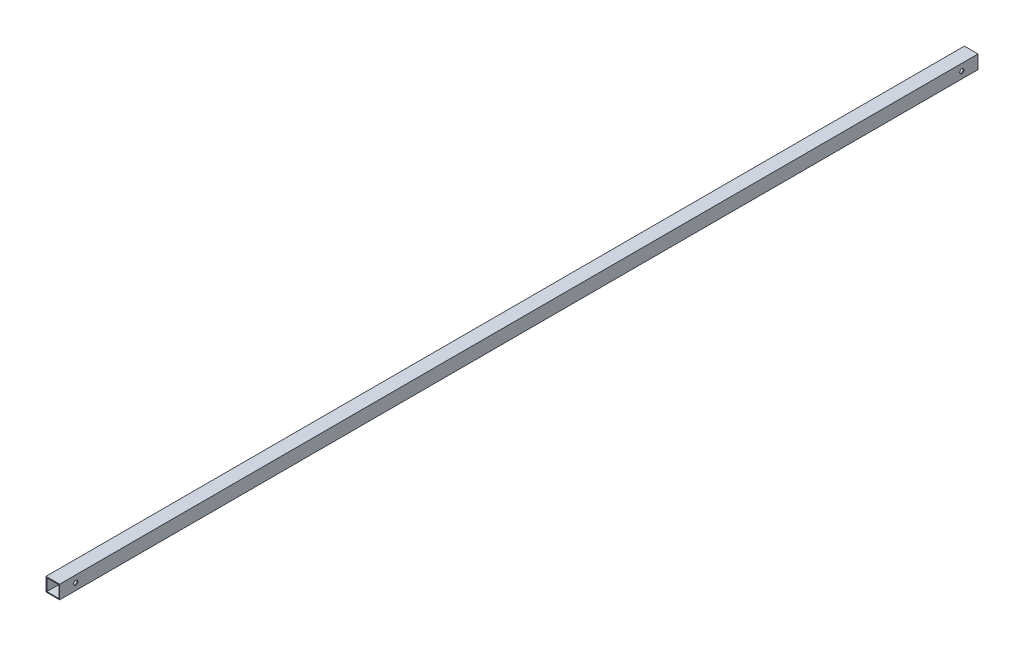
ISO-10303-21;
HEADER;
FILE_DESCRIPTION(('STEP AP214'),'2;1');
FILE_NAME('part.step','',(''),(''),'','','');
FILE_SCHEMA(('AUTOMOTIVE_DESIGN { 1 0 10303 214 1 1 1 1 }'));
ENDSEC;
DATA;
#1=APPLICATION_CONTEXT('core data for automotive mechanical design processes');
#2=APPLICATION_PROTOCOL_DEFINITION('international standard','automotive_design',2000,#1);
#3=PRODUCT_CONTEXT('',#1,'mechanical');
#4=PRODUCT('Part','Part','',(#3));
#5=PRODUCT_RELATED_PRODUCT_CATEGORY('part','',(#4));
#6=PRODUCT_DEFINITION_FORMATION('','',#4);
#7=PRODUCT_DEFINITION_CONTEXT('part definition',#1,'design');
#8=PRODUCT_DEFINITION('design','',#6,#7);
#9=PRODUCT_DEFINITION_SHAPE('','',#8);
#10=(LENGTH_UNIT() NAMED_UNIT(*) SI_UNIT(.MILLI.,.METRE.));
#11=(NAMED_UNIT(*) PLANE_ANGLE_UNIT() SI_UNIT($,.RADIAN.));
#12=(NAMED_UNIT(*) SI_UNIT($,.STERADIAN.) SOLID_ANGLE_UNIT());
#13=UNCERTAINTY_MEASURE_WITH_UNIT(LENGTH_MEASURE(1.E-05),#10,'distance_accuracy_value','');
#14=(GEOMETRIC_REPRESENTATION_CONTEXT(3) GLOBAL_UNCERTAINTY_ASSIGNED_CONTEXT((#13)) GLOBAL_UNIT_ASSIGNED_CONTEXT((#10,
#11,#12)) REPRESENTATION_CONTEXT('',''));
#15=CARTESIAN_POINT('',(0.,0.,0.));
#16=DIRECTION('',(0.,0.,1.));
#17=DIRECTION('',(1.,0.,0.));
#18=AXIS2_PLACEMENT_3D('',#15,#16,#17);
#19=CARTESIAN_POINT('',(-8.,-8.,540.));
#20=DIRECTION('',(0.,0.,1.));
#21=DIRECTION('',(1.,0.,0.));
#22=AXIS2_PLACEMENT_3D('',#19,#20,#21);
#23=PLANE('',#22);
#24=DIRECTION('',(0.,-1.,0.));
#25=VECTOR('',#24,1.);
#26=CARTESIAN_POINT('',(-8.,-8.,540.));
#27=LINE('',#26,#25);
#28=CARTESIAN_POINT('',(-8.,8.,540.));
#29=VERTEX_POINT('',#28);
#30=CARTESIAN_POINT('',(-8.,-8.,540.));
#31=VERTEX_POINT('',#30);
#32=EDGE_CURVE('E161',#29,#31,#27,.T.);
#33=ORIENTED_EDGE('',*,*,#32,.T.);
#34=DIRECTION('',(1.,0.,0.));
#35=VECTOR('',#34,1.);
#36=CARTESIAN_POINT('',(8.,-8.,540.));
#37=LINE('',#36,#35);
#38=CARTESIAN_POINT('',(8.,-8.,540.));
#39=VERTEX_POINT('',#38);
#40=EDGE_CURVE('E164',#31,#39,#37,.T.);
#41=ORIENTED_EDGE('',*,*,#40,.T.);
#42=DIRECTION('',(0.,1.,0.));
#43=VECTOR('',#42,1.);
#44=CARTESIAN_POINT('',(8.,-8.,540.));
#45=LINE('',#44,#43);
#46=CARTESIAN_POINT('',(8.,8.,540.));
#47=VERTEX_POINT('',#46);
#48=EDGE_CURVE('E167',#39,#47,#45,.T.);
#49=ORIENTED_EDGE('',*,*,#48,.T.);
#50=DIRECTION('',(-1.,0.,0.));
#51=VECTOR('',#50,1.);
#52=CARTESIAN_POINT('',(8.,8.,540.));
#53=LINE('',#52,#51);
#54=EDGE_CURVE('E169',#47,#29,#53,.T.);
#55=ORIENTED_EDGE('',*,*,#54,.T.);
#56=EDGE_LOOP('',(#33,#41,#49,#55));
#57=FACE_BOUND('',#56,.T.);
#58=DIRECTION('',(1.,0.,0.));
#59=VECTOR('',#58,1.);
#60=CARTESIAN_POINT('',(8.,-7.,540.));
#61=LINE('',#60,#59);
#62=CARTESIAN_POINT('',(-7.,-7.,540.));
#63=VERTEX_POINT('',#62);
#64=CARTESIAN_POINT('',(7.,-7.,540.));
#65=VERTEX_POINT('',#64);
#66=EDGE_CURVE('E131',#63,#65,#61,.T.);
#67=ORIENTED_EDGE('',*,*,#66,.F.);
#68=DIRECTION('',(0.,-1.,0.));
#69=VECTOR('',#68,1.);
#70=CARTESIAN_POINT('',(-7.,-8.,540.));
#71=LINE('',#70,#69);
#72=CARTESIAN_POINT('',(-7.,7.,540.));
#73=VERTEX_POINT('',#72);
#74=EDGE_CURVE('E123',#73,#63,#71,.T.);
#75=ORIENTED_EDGE('',*,*,#74,.F.);
#76=DIRECTION('',(-1.,0.,0.));
#77=VECTOR('',#76,1.);
#78=CARTESIAN_POINT('',(8.,7.,540.));
#79=LINE('',#78,#77);
#80=CARTESIAN_POINT('',(7.,7.,540.));
#81=VERTEX_POINT('',#80);
#82=EDGE_CURVE('E145',#81,#73,#79,.T.);
#83=ORIENTED_EDGE('',*,*,#82,.F.);
#84=DIRECTION('',(0.,1.,0.));
#85=VECTOR('',#84,1.);
#86=CARTESIAN_POINT('',(7.,-8.,540.));
#87=LINE('',#86,#85);
#88=EDGE_CURVE('E143',#65,#81,#87,.T.);
#89=ORIENTED_EDGE('',*,*,#88,.F.);
#90=EDGE_LOOP('',(#67,#75,#83,#89));
#91=FACE_BOUND('',#90,.T.);
#92=ADVANCED_FACE('F56',(#57,#91),#23,.T.);
#93=CARTESIAN_POINT('',(-8.,-8.,-540.));
#94=DIRECTION('',(0.,0.,1.));
#95=DIRECTION('',(1.,0.,0.));
#96=AXIS2_PLACEMENT_3D('',#93,#94,#95);
#97=PLANE('',#96);
#98=DIRECTION('',(0.,-1.,0.));
#99=VECTOR('',#98,1.);
#100=CARTESIAN_POINT('',(-8.,-8.,-540.));
#101=LINE('',#100,#99);
#102=CARTESIAN_POINT('',(-8.,8.,-540.));
#103=VERTEX_POINT('',#102);
#104=CARTESIAN_POINT('',(-8.,-8.,-540.));
#105=VERTEX_POINT('',#104);
#106=EDGE_CURVE('E139',#103,#105,#101,.T.);
#107=ORIENTED_EDGE('',*,*,#106,.F.);
#108=DIRECTION('',(-1.,0.,0.));
#109=VECTOR('',#108,1.);
#110=CARTESIAN_POINT('',(8.,8.,-540.));
#111=LINE('',#110,#109);
#112=CARTESIAN_POINT('',(8.,8.,-540.));
#113=VERTEX_POINT('',#112);
#114=EDGE_CURVE('E165',#113,#103,#111,.T.);
#115=ORIENTED_EDGE('',*,*,#114,.F.);
#116=DIRECTION('',(0.,1.,0.));
#117=VECTOR('',#116,1.);
#118=CARTESIAN_POINT('',(8.,-8.,-540.));
#119=LINE('',#118,#117);
#120=CARTESIAN_POINT('',(8.,-8.,-540.));
#121=VERTEX_POINT('',#120);
#122=EDGE_CURVE('E176',#121,#113,#119,.T.);
#123=ORIENTED_EDGE('',*,*,#122,.F.);
#124=DIRECTION('',(1.,0.,0.));
#125=VECTOR('',#124,1.);
#126=CARTESIAN_POINT('',(8.,-8.,-540.));
#127=LINE('',#126,#125);
#128=EDGE_CURVE('E174',#105,#121,#127,.T.);
#129=ORIENTED_EDGE('',*,*,#128,.F.);
#130=EDGE_LOOP('',(#107,#115,#123,#129));
#131=FACE_BOUND('',#130,.T.);
#132=DIRECTION('',(0.,-1.,0.));
#133=VECTOR('',#132,1.);
#134=CARTESIAN_POINT('',(-7.,-8.,-540.));
#135=LINE('',#134,#133);
#136=CARTESIAN_POINT('',(-7.,7.,-540.));
#137=VERTEX_POINT('',#136);
#138=CARTESIAN_POINT('',(-7.,-7.,-540.));
#139=VERTEX_POINT('',#138);
#140=EDGE_CURVE('E81',#137,#139,#135,.T.);
#141=ORIENTED_EDGE('',*,*,#140,.T.);
#142=DIRECTION('',(1.,0.,0.));
#143=VECTOR('',#142,1.);
#144=CARTESIAN_POINT('',(8.,-7.,-540.));
#145=LINE('',#144,#143);
#146=CARTESIAN_POINT('',(7.,-7.,-540.));
#147=VERTEX_POINT('',#146);
#148=EDGE_CURVE('E138',#139,#147,#145,.T.);
#149=ORIENTED_EDGE('',*,*,#148,.T.);
#150=DIRECTION('',(0.,1.,0.));
#151=VECTOR('',#150,1.);
#152=CARTESIAN_POINT('',(7.,-8.,-540.));
#153=LINE('',#152,#151);
#154=CARTESIAN_POINT('',(7.,7.,-540.));
#155=VERTEX_POINT('',#154);
#156=EDGE_CURVE('E153',#147,#155,#153,.T.);
#157=ORIENTED_EDGE('',*,*,#156,.T.);
#158=DIRECTION('',(-1.,0.,0.));
#159=VECTOR('',#158,1.);
#160=CARTESIAN_POINT('',(8.,7.,-540.));
#161=LINE('',#160,#159);
#162=EDGE_CURVE('E132',#155,#137,#161,.T.);
#163=ORIENTED_EDGE('',*,*,#162,.T.);
#164=EDGE_LOOP('',(#141,#149,#157,#163));
#165=FACE_BOUND('',#164,.T.);
#166=ADVANCED_FACE('F223',(#131,#165),#97,.F.);
#167=CARTESIAN_POINT('',(-8.,-8.,540.));
#168=DIRECTION('',(1.,0.,0.));
#169=DIRECTION('',(0.,0.,-1.));
#170=AXIS2_PLACEMENT_3D('',#167,#168,#169);
#171=PLANE('',#170);
#172=CARTESIAN_POINT('',(-8.,0.,-521.));
#173=DIRECTION('',(1.,0.,0.));
#174=DIRECTION('',(0.,0.,1.));
#175=AXIS2_PLACEMENT_3D('',#172,#173,#174);
#176=CIRCLE('',#175,2.50000000000003);
#177=CARTESIAN_POINT('',(-8.,0.,-518.5));
#178=VERTEX_POINT('',#177);
#179=EDGE_CURVE('E205',#178,#178,#176,.T.);
#180=ORIENTED_EDGE('',*,*,#179,.T.);
#181=EDGE_LOOP('',(#180));
#182=FACE_BOUND('',#181,.T.);
#183=CARTESIAN_POINT('',(-8.,0.,521.));
#184=DIRECTION('',(1.,0.,0.));
#185=DIRECTION('',(0.,0.,-1.));
#186=AXIS2_PLACEMENT_3D('',#183,#184,#185);
#187=CIRCLE('',#186,2.50000000000003);
#188=CARTESIAN_POINT('',(-8.,0.,518.5));
#189=VERTEX_POINT('',#188);
#190=EDGE_CURVE('E187',#189,#189,#187,.T.);
#191=ORIENTED_EDGE('',*,*,#190,.T.);
#192=EDGE_LOOP('',(#191));
#193=FACE_BOUND('',#192,.T.);
#194=ORIENTED_EDGE('',*,*,#106,.T.);
#195=DIRECTION('',(0.,0.,-1.));
#196=VECTOR('',#195,1.);
#197=CARTESIAN_POINT('',(-8.,-8.,540.));
#198=LINE('',#197,#196);
#199=EDGE_CURVE('E12',#31,#105,#198,.T.);
#200=ORIENTED_EDGE('',*,*,#199,.F.);
#201=ORIENTED_EDGE('',*,*,#32,.F.);
#202=DIRECTION('',(0.,0.,-1.));
#203=VECTOR('',#202,1.);
#204=CARTESIAN_POINT('',(-8.,8.,540.));
#205=LINE('',#204,#203);
#206=EDGE_CURVE('E171',#29,#103,#205,.T.);
#207=ORIENTED_EDGE('',*,*,#206,.T.);
#208=EDGE_LOOP('',(#194,#200,#201,#207));
#209=FACE_BOUND('',#208,.T.);
#210=ADVANCED_FACE('F58',(#182,#193,#209),#171,.F.);
#211=CARTESIAN_POINT('',(8.,-8.,540.));
#212=DIRECTION('',(0.,1.,0.));
#213=DIRECTION('',(-1.,0.,0.));
#214=AXIS2_PLACEMENT_3D('',#211,#212,#213);
#215=PLANE('',#214);
#216=ORIENTED_EDGE('',*,*,#128,.T.);
#217=DIRECTION('',(0.,0.,-1.));
#218=VECTOR('',#217,1.);
#219=CARTESIAN_POINT('',(8.,-8.,540.));
#220=LINE('',#219,#218);
#221=EDGE_CURVE('E65',#39,#121,#220,.T.);
#222=ORIENTED_EDGE('',*,*,#221,.F.);
#223=ORIENTED_EDGE('',*,*,#40,.F.);
#224=ORIENTED_EDGE('',*,*,#199,.T.);
#225=EDGE_LOOP('',(#216,#222,#223,#224));
#226=FACE_BOUND('',#225,.T.);
#227=ADVANCED_FACE('F249',(#226),#215,.F.);
#228=CARTESIAN_POINT('',(8.,-8.,540.));
#229=DIRECTION('',(-1.,0.,0.));
#230=DIRECTION('',(0.,0.,1.));
#231=AXIS2_PLACEMENT_3D('',#228,#229,#230);
#232=PLANE('',#231);
#233=CARTESIAN_POINT('',(8.,0.,-521.));
#234=DIRECTION('',(1.,0.,0.));
#235=DIRECTION('',(0.,0.,1.));
#236=AXIS2_PLACEMENT_3D('',#233,#234,#235);
#237=CIRCLE('',#236,2.50000000000003);
#238=CARTESIAN_POINT('',(8.,0.,-518.5));
#239=VERTEX_POINT('',#238);
#240=EDGE_CURVE('E202',#239,#239,#237,.T.);
#241=ORIENTED_EDGE('',*,*,#240,.F.);
#242=EDGE_LOOP('',(#241));
#243=FACE_BOUND('',#242,.T.);
#244=CARTESIAN_POINT('',(8.,0.,521.));
#245=DIRECTION('',(1.,0.,0.));
#246=DIRECTION('',(0.,0.,-1.));
#247=AXIS2_PLACEMENT_3D('',#244,#245,#246);
#248=CIRCLE('',#247,2.50000000000003);
#249=CARTESIAN_POINT('',(8.,0.,518.5));
#250=VERTEX_POINT('',#249);
#251=EDGE_CURVE('E192',#250,#250,#248,.T.);
#252=ORIENTED_EDGE('',*,*,#251,.F.);
#253=EDGE_LOOP('',(#252));
#254=FACE_BOUND('',#253,.T.);
#255=ORIENTED_EDGE('',*,*,#122,.T.);
#256=DIRECTION('',(0.,0.,-1.));
#257=VECTOR('',#256,1.);
#258=CARTESIAN_POINT('',(8.,8.,540.));
#259=LINE('',#258,#257);
#260=EDGE_CURVE('E181',#47,#113,#259,.T.);
#261=ORIENTED_EDGE('',*,*,#260,.F.);
#262=ORIENTED_EDGE('',*,*,#48,.F.);
#263=ORIENTED_EDGE('',*,*,#221,.T.);
#264=EDGE_LOOP('',(#255,#261,#262,#263));
#265=FACE_BOUND('',#264,.T.);
#266=ADVANCED_FACE('F246',(#243,#254,#265),#232,.F.);
#267=CARTESIAN_POINT('',(8.,8.,540.));
#268=DIRECTION('',(0.,-1.,0.));
#269=DIRECTION('',(0.,0.,-1.));
#270=AXIS2_PLACEMENT_3D('',#267,#268,#269);
#271=PLANE('',#270);
#272=ORIENTED_EDGE('',*,*,#114,.T.);
#273=ORIENTED_EDGE('',*,*,#206,.F.);
#274=ORIENTED_EDGE('',*,*,#54,.F.);
#275=ORIENTED_EDGE('',*,*,#260,.T.);
#276=EDGE_LOOP('',(#272,#273,#274,#275));
#277=FACE_BOUND('',#276,.T.);
#278=ADVANCED_FACE('F243',(#277),#271,.F.);
#279=CARTESIAN_POINT('',(-7.,-8.,540.));
#280=DIRECTION('',(1.,0.,0.));
#281=DIRECTION('',(0.,0.,-1.));
#282=AXIS2_PLACEMENT_3D('',#279,#280,#281);
#283=PLANE('',#282);
#284=CARTESIAN_POINT('',(-7.,0.,-521.));
#285=DIRECTION('',(1.,0.,0.));
#286=DIRECTION('',(0.,0.,-1.));
#287=AXIS2_PLACEMENT_3D('',#284,#285,#286);
#288=CIRCLE('',#287,2.50000000000003);
#289=CARTESIAN_POINT('',(-7.,0.,-523.5));
#290=VERTEX_POINT('',#289);
#291=EDGE_CURVE('E197',#290,#290,#288,.T.);
#292=ORIENTED_EDGE('',*,*,#291,.F.);
#293=EDGE_LOOP('',(#292));
#294=FACE_BOUND('',#293,.T.);
#295=CARTESIAN_POINT('',(-7.,0.,521.));
#296=DIRECTION('',(1.,0.,0.));
#297=DIRECTION('',(0.,0.,-1.));
#298=AXIS2_PLACEMENT_3D('',#295,#296,#297);
#299=CIRCLE('',#298,2.50000000000003);
#300=CARTESIAN_POINT('',(-7.,0.,518.5));
#301=VERTEX_POINT('',#300);
#302=EDGE_CURVE('E151',#301,#301,#299,.T.);
#303=ORIENTED_EDGE('',*,*,#302,.F.);
#304=EDGE_LOOP('',(#303));
#305=FACE_BOUND('',#304,.T.);
#306=ORIENTED_EDGE('',*,*,#140,.F.);
#307=DIRECTION('',(0.,0.,-1.));
#308=VECTOR('',#307,1.);
#309=CARTESIAN_POINT('',(-7.,7.,540.));
#310=LINE('',#309,#308);
#311=EDGE_CURVE('E127',#73,#137,#310,.T.);
#312=ORIENTED_EDGE('',*,*,#311,.F.);
#313=ORIENTED_EDGE('',*,*,#74,.T.);
#314=DIRECTION('',(0.,0.,-1.));
#315=VECTOR('',#314,1.);
#316=CARTESIAN_POINT('',(-7.,-7.,540.));
#317=LINE('',#316,#315);
#318=EDGE_CURVE('E126',#63,#139,#317,.T.);
#319=ORIENTED_EDGE('',*,*,#318,.T.);
#320=EDGE_LOOP('',(#306,#312,#313,#319));
#321=FACE_BOUND('',#320,.T.);
#322=ADVANCED_FACE('F125',(#294,#305,#321),#283,.T.);
#323=CARTESIAN_POINT('',(8.,-7.,540.));
#324=DIRECTION('',(0.,1.,0.));
#325=DIRECTION('',(-1.,0.,0.));
#326=AXIS2_PLACEMENT_3D('',#323,#324,#325);
#327=PLANE('',#326);
#328=ORIENTED_EDGE('',*,*,#148,.F.);
#329=ORIENTED_EDGE('',*,*,#318,.F.);
#330=ORIENTED_EDGE('',*,*,#66,.T.);
#331=DIRECTION('',(0.,0.,-1.));
#332=VECTOR('',#331,1.);
#333=CARTESIAN_POINT('',(7.,-7.,540.));
#334=LINE('',#333,#332);
#335=EDGE_CURVE('E140',#65,#147,#334,.T.);
#336=ORIENTED_EDGE('',*,*,#335,.T.);
#337=EDGE_LOOP('',(#328,#329,#330,#336));
#338=FACE_BOUND('',#337,.T.);
#339=ADVANCED_FACE('F135',(#338),#327,.T.);
#340=CARTESIAN_POINT('',(7.,-8.,540.));
#341=DIRECTION('',(-1.,0.,0.));
#342=DIRECTION('',(0.,0.,1.));
#343=AXIS2_PLACEMENT_3D('',#340,#341,#342);
#344=PLANE('',#343);
#345=CARTESIAN_POINT('',(7.,0.,-521.));
#346=DIRECTION('',(-1.,0.,0.));
#347=DIRECTION('',(0.,0.,1.));
#348=AXIS2_PLACEMENT_3D('',#345,#346,#347);
#349=CIRCLE('',#348,2.50000000000003);
#350=CARTESIAN_POINT('',(7.,0.,-518.5));
#351=VERTEX_POINT('',#350);
#352=EDGE_CURVE('E60',#351,#351,#349,.T.);
#353=ORIENTED_EDGE('',*,*,#352,.F.);
#354=EDGE_LOOP('',(#353));
#355=FACE_BOUND('',#354,.T.);
#356=CARTESIAN_POINT('',(7.,0.,521.));
#357=DIRECTION('',(-1.,0.,0.));
#358=DIRECTION('',(0.,0.,1.));
#359=AXIS2_PLACEMENT_3D('',#356,#357,#358);
#360=CIRCLE('',#359,2.50000000000003);
#361=CARTESIAN_POINT('',(7.,0.,523.5));
#362=VERTEX_POINT('',#361);
#363=EDGE_CURVE('E185',#362,#362,#360,.T.);
#364=ORIENTED_EDGE('',*,*,#363,.F.);
#365=EDGE_LOOP('',(#364));
#366=FACE_BOUND('',#365,.T.);
#367=ORIENTED_EDGE('',*,*,#156,.F.);
#368=ORIENTED_EDGE('',*,*,#335,.F.);
#369=ORIENTED_EDGE('',*,*,#88,.T.);
#370=DIRECTION('',(0.,0.,-1.));
#371=VECTOR('',#370,1.);
#372=CARTESIAN_POINT('',(7.,7.,540.));
#373=LINE('',#372,#371);
#374=EDGE_CURVE('E73',#81,#155,#373,.T.);
#375=ORIENTED_EDGE('',*,*,#374,.T.);
#376=EDGE_LOOP('',(#367,#368,#369,#375));
#377=FACE_BOUND('',#376,.T.);
#378=ADVANCED_FACE('F215',(#355,#366,#377),#344,.T.);
#379=CARTESIAN_POINT('',(8.,7.,540.));
#380=DIRECTION('',(0.,-1.,0.));
#381=DIRECTION('',(0.,0.,-1.));
#382=AXIS2_PLACEMENT_3D('',#379,#380,#381);
#383=PLANE('',#382);
#384=ORIENTED_EDGE('',*,*,#162,.F.);
#385=ORIENTED_EDGE('',*,*,#374,.F.);
#386=ORIENTED_EDGE('',*,*,#82,.T.);
#387=ORIENTED_EDGE('',*,*,#311,.T.);
#388=EDGE_LOOP('',(#384,#385,#386,#387));
#389=FACE_BOUND('',#388,.T.);
#390=ADVANCED_FACE('F218',(#389),#383,.T.);
#391=CARTESIAN_POINT('',(-8.,0.,521.));
#392=DIRECTION('',(1.,0.,0.));
#393=DIRECTION('',(0.,0.,-1.));
#394=AXIS2_PLACEMENT_3D('',#391,#392,#393);
#395=CYLINDRICAL_SURFACE('',#394,2.50000000000003);
#396=ORIENTED_EDGE('',*,*,#363,.T.);
#397=EDGE_LOOP('',(#396));
#398=FACE_BOUND('',#397,.T.);
#399=ORIENTED_EDGE('',*,*,#251,.T.);
#400=EDGE_LOOP('',(#399));
#401=FACE_BOUND('',#400,.T.);
#402=ADVANCED_FACE('F225',(#398,#401),#395,.F.);
#403=ORIENTED_EDGE('',*,*,#302,.T.);
#404=EDGE_LOOP('',(#403));
#405=FACE_BOUND('',#404,.T.);
#406=ORIENTED_EDGE('',*,*,#190,.F.);
#407=EDGE_LOOP('',(#406));
#408=FACE_BOUND('',#407,.T.);
#409=ADVANCED_FACE('F230',(#405,#408),#395,.F.);
#410=CARTESIAN_POINT('',(-8.,0.,-521.));
#411=DIRECTION('',(1.,0.,0.));
#412=DIRECTION('',(0.,0.,-1.));
#413=AXIS2_PLACEMENT_3D('',#410,#411,#412);
#414=CYLINDRICAL_SURFACE('',#413,2.50000000000003);
#415=ORIENTED_EDGE('',*,*,#352,.T.);
#416=EDGE_LOOP('',(#415));
#417=FACE_BOUND('',#416,.T.);
#418=ORIENTED_EDGE('',*,*,#240,.T.);
#419=EDGE_LOOP('',(#418));
#420=FACE_BOUND('',#419,.T.);
#421=ADVANCED_FACE('F212',(#417,#420),#414,.F.);
#422=ORIENTED_EDGE('',*,*,#291,.T.);
#423=EDGE_LOOP('',(#422));
#424=FACE_BOUND('',#423,.T.);
#425=ORIENTED_EDGE('',*,*,#179,.F.);
#426=EDGE_LOOP('',(#425));
#427=FACE_BOUND('',#426,.T.);
#428=ADVANCED_FACE('F327',(#424,#427),#414,.F.);
#429=CLOSED_SHELL('',(#92,#166,#210,#227,#266,#278,#322,#339,#378,#390,#402,#409,#421,#428));
#430=MANIFOLD_SOLID_BREP('B2',#429);
#431=ADVANCED_BREP_SHAPE_REPRESENTATION('',(#18,#430),#14);
#432=SHAPE_DEFINITION_REPRESENTATION(#9,#431);
ENDSEC;
END-ISO-10303-21;
